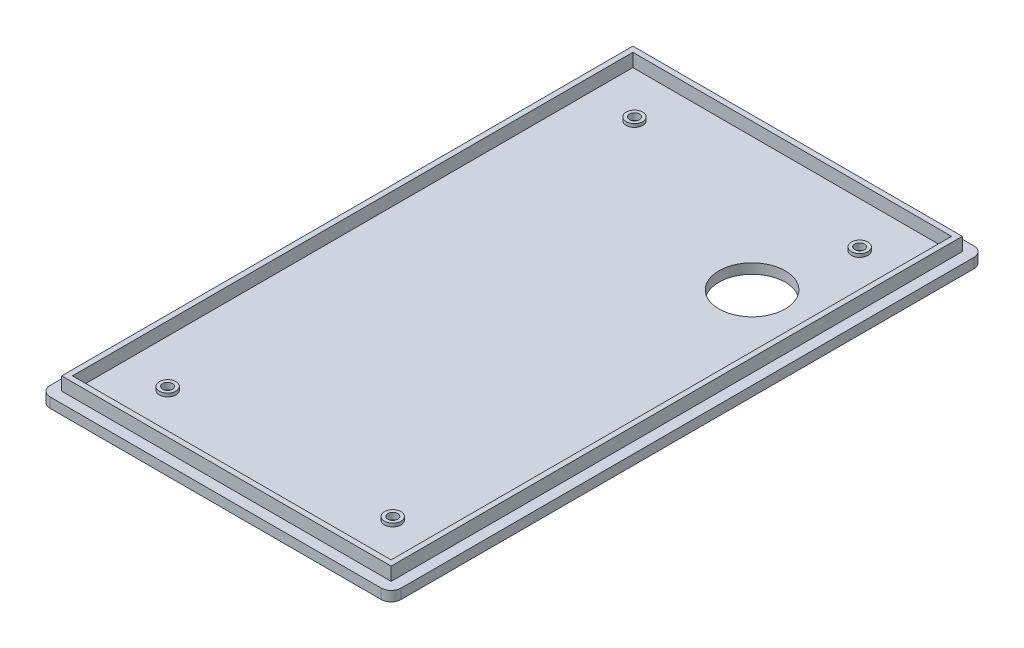
ISO-10303-21;
HEADER;
FILE_DESCRIPTION(('STEP AP214'),'2;1');
FILE_NAME('part.step','',(''),(''),'','','');
FILE_SCHEMA(('AUTOMOTIVE_DESIGN { 1 0 10303 214 1 1 1 1 }'));
ENDSEC;
DATA;
#1=APPLICATION_CONTEXT('core data for automotive mechanical design processes');
#2=APPLICATION_PROTOCOL_DEFINITION('international standard','automotive_design',2000,#1);
#3=PRODUCT_CONTEXT('',#1,'mechanical');
#4=PRODUCT('Part','Part','',(#3));
#5=PRODUCT_RELATED_PRODUCT_CATEGORY('part','',(#4));
#6=PRODUCT_DEFINITION_FORMATION('','',#4);
#7=PRODUCT_DEFINITION_CONTEXT('part definition',#1,'design');
#8=PRODUCT_DEFINITION('design','',#6,#7);
#9=PRODUCT_DEFINITION_SHAPE('','',#8);
#10=(LENGTH_UNIT() NAMED_UNIT(*) SI_UNIT(.MILLI.,.METRE.));
#11=(NAMED_UNIT(*) PLANE_ANGLE_UNIT() SI_UNIT($,.RADIAN.));
#12=(NAMED_UNIT(*) SI_UNIT($,.STERADIAN.) SOLID_ANGLE_UNIT());
#13=UNCERTAINTY_MEASURE_WITH_UNIT(LENGTH_MEASURE(1.E-05),#10,'distance_accuracy_value','');
#14=(GEOMETRIC_REPRESENTATION_CONTEXT(3) GLOBAL_UNCERTAINTY_ASSIGNED_CONTEXT((#13)) GLOBAL_UNIT_ASSIGNED_CONTEXT((#10,
#11,#12)) REPRESENTATION_CONTEXT('',''));
#15=CARTESIAN_POINT('',(0.,0.,0.));
#16=DIRECTION('',(0.,0.,1.));
#17=DIRECTION('',(1.,0.,0.));
#18=AXIS2_PLACEMENT_3D('',#15,#16,#17);
#19=CARTESIAN_POINT('',(-34.,23.,-71.));
#20=DIRECTION('',(0.,-1.,0.));
#21=DIRECTION('',(0.,0.,-1.));
#22=AXIS2_PLACEMENT_3D('',#19,#20,#21);
#23=CYLINDRICAL_SURFACE('',#22,1.5);
#24=CARTESIAN_POINT('',(-34.,2.,-71.));
#25=DIRECTION('',(0.,-1.,0.));
#26=DIRECTION('',(0.,0.,-1.));
#27=AXIS2_PLACEMENT_3D('',#24,#25,#26);
#28=CIRCLE('',#27,1.5);
#29=CARTESIAN_POINT('',(-34.,2.,-72.5));
#30=VERTEX_POINT('',#29);
#31=EDGE_CURVE('E45',#30,#30,#28,.T.);
#32=ORIENTED_EDGE('',*,*,#31,.T.);
#33=EDGE_LOOP('',(#32));
#34=FACE_BOUND('',#33,.T.);
#35=CARTESIAN_POINT('',(-34.,4.,-71.));
#36=DIRECTION('',(0.,1.,0.));
#37=DIRECTION('',(0.,0.,1.));
#38=AXIS2_PLACEMENT_3D('',#35,#36,#37);
#39=CIRCLE('',#38,1.5);
#40=CARTESIAN_POINT('',(-34.,4.,-69.5));
#41=VERTEX_POINT('',#40);
#42=EDGE_CURVE('E863',#41,#41,#39,.F.);
#43=ORIENTED_EDGE('',*,*,#42,.F.);
#44=EDGE_LOOP('',(#43));
#45=FACE_BOUND('',#44,.T.);
#46=ADVANCED_FACE('F41',(#34,#45),#23,.F.);
#47=CARTESIAN_POINT('',(34.,23.,-71.));
#48=DIRECTION('',(0.,-1.,0.));
#49=DIRECTION('',(0.,0.,-1.));
#50=AXIS2_PLACEMENT_3D('',#47,#48,#49);
#51=CYLINDRICAL_SURFACE('',#50,1.5);
#52=CARTESIAN_POINT('',(34.,2.,-71.));
#53=DIRECTION('',(0.,-1.,0.));
#54=DIRECTION('',(0.,0.,-1.));
#55=AXIS2_PLACEMENT_3D('',#52,#53,#54);
#56=CIRCLE('',#55,1.5);
#57=CARTESIAN_POINT('',(34.,2.,-72.5));
#58=VERTEX_POINT('',#57);
#59=EDGE_CURVE('E315',#58,#58,#56,.T.);
#60=ORIENTED_EDGE('',*,*,#59,.T.);
#61=EDGE_LOOP('',(#60));
#62=FACE_BOUND('',#61,.T.);
#63=CARTESIAN_POINT('',(34.,4.,-71.));
#64=DIRECTION('',(0.,1.,0.));
#65=DIRECTION('',(0.,0.,1.));
#66=AXIS2_PLACEMENT_3D('',#63,#64,#65);
#67=CIRCLE('',#66,1.5);
#68=CARTESIAN_POINT('',(34.,4.,-69.5));
#69=VERTEX_POINT('',#68);
#70=EDGE_CURVE('E870',#69,#69,#67,.F.);
#71=ORIENTED_EDGE('',*,*,#70,.F.);
#72=EDGE_LOOP('',(#71));
#73=FACE_BOUND('',#72,.T.);
#74=ADVANCED_FACE('F392',(#62,#73),#51,.F.);
#75=CARTESIAN_POINT('',(34.,23.,70.));
#76=DIRECTION('',(0.,-1.,0.));
#77=DIRECTION('',(0.,0.,-1.));
#78=AXIS2_PLACEMENT_3D('',#75,#76,#77);
#79=CYLINDRICAL_SURFACE('',#78,1.5);
#80=CARTESIAN_POINT('',(34.,2.,70.));
#81=DIRECTION('',(0.,-1.,0.));
#82=DIRECTION('',(0.,0.,-1.));
#83=AXIS2_PLACEMENT_3D('',#80,#81,#82);
#84=CIRCLE('',#83,1.5);
#85=CARTESIAN_POINT('',(34.,2.,68.5));
#86=VERTEX_POINT('',#85);
#87=EDGE_CURVE('E311',#86,#86,#84,.T.);
#88=ORIENTED_EDGE('',*,*,#87,.T.);
#89=EDGE_LOOP('',(#88));
#90=FACE_BOUND('',#89,.T.);
#91=CARTESIAN_POINT('',(34.,4.,70.));
#92=DIRECTION('',(0.,1.,0.));
#93=DIRECTION('',(0.,0.,1.));
#94=AXIS2_PLACEMENT_3D('',#91,#92,#93);
#95=CIRCLE('',#94,1.5);
#96=CARTESIAN_POINT('',(34.,4.,71.5));
#97=VERTEX_POINT('',#96);
#98=EDGE_CURVE('E878',#97,#97,#95,.F.);
#99=ORIENTED_EDGE('',*,*,#98,.F.);
#100=EDGE_LOOP('',(#99));
#101=FACE_BOUND('',#100,.T.);
#102=ADVANCED_FACE('F382',(#90,#101),#79,.F.);
#103=CARTESIAN_POINT('',(-34.,23.,70.));
#104=DIRECTION('',(0.,-1.,0.));
#105=DIRECTION('',(0.,0.,-1.));
#106=AXIS2_PLACEMENT_3D('',#103,#104,#105);
#107=CYLINDRICAL_SURFACE('',#106,1.5);
#108=CARTESIAN_POINT('',(-34.,2.,70.));
#109=DIRECTION('',(0.,-1.,0.));
#110=DIRECTION('',(0.,0.,-1.));
#111=AXIS2_PLACEMENT_3D('',#108,#109,#110);
#112=CIRCLE('',#111,1.5);
#113=CARTESIAN_POINT('',(-34.,2.,68.5));
#114=VERTEX_POINT('',#113);
#115=EDGE_CURVE('E307',#114,#114,#112,.T.);
#116=ORIENTED_EDGE('',*,*,#115,.T.);
#117=EDGE_LOOP('',(#116));
#118=FACE_BOUND('',#117,.T.);
#119=CARTESIAN_POINT('',(-34.,4.,70.));
#120=DIRECTION('',(0.,1.,0.));
#121=DIRECTION('',(0.,0.,1.));
#122=AXIS2_PLACEMENT_3D('',#119,#120,#121);
#123=CIRCLE('',#122,1.5);
#124=CARTESIAN_POINT('',(-34.,4.,71.5));
#125=VERTEX_POINT('',#124);
#126=EDGE_CURVE('E874',#125,#125,#123,.F.);
#127=ORIENTED_EDGE('',*,*,#126,.F.);
#128=EDGE_LOOP('',(#127));
#129=FACE_BOUND('',#128,.T.);
#130=ADVANCED_FACE('F372',(#118,#129),#107,.F.);
#131=CARTESIAN_POINT('',(0.,3.,0.));
#132=DIRECTION('',(0.,1.,0.));
#133=DIRECTION('',(0.,0.,1.));
#134=AXIS2_PLACEMENT_3D('',#131,#132,#133);
#135=PLANE('',#134);
#136=DIRECTION('',(0.,0.,1.));
#137=VECTOR('',#136,1.);
#138=CARTESIAN_POINT('',(53.,3.,0.));
#139=LINE('',#138,#137);
#140=CARTESIAN_POINT('',(53.,3.,-86.5));
#141=VERTEX_POINT('',#140);
#142=CARTESIAN_POINT('',(53.,3.,86.5));
#143=VERTEX_POINT('',#142);
#144=EDGE_CURVE('E228',#141,#143,#139,.T.);
#145=ORIENTED_EDGE('',*,*,#144,.F.);
#146=CARTESIAN_POINT('',(50.,3.,-86.5));
#147=DIRECTION('',(0.,1.,0.));
#148=DIRECTION('',(0.,0.,1.));
#149=AXIS2_PLACEMENT_3D('',#146,#147,#148);
#150=CIRCLE('',#149,3.);
#151=CARTESIAN_POINT('',(50.,3.,-89.5));
#152=VERTEX_POINT('',#151);
#153=EDGE_CURVE('E294',#141,#152,#150,.T.);
#154=ORIENTED_EDGE('',*,*,#153,.T.);
#155=DIRECTION('',(1.,0.,0.));
#156=VECTOR('',#155,1.);
#157=CARTESIAN_POINT('',(0.,3.,-89.5));
#158=LINE('',#157,#156);
#159=CARTESIAN_POINT('',(-50.,3.,-89.5));
#160=VERTEX_POINT('',#159);
#161=EDGE_CURVE('E232',#160,#152,#158,.T.);
#162=ORIENTED_EDGE('',*,*,#161,.F.);
#163=CARTESIAN_POINT('',(-50.,3.,-86.5));
#164=DIRECTION('',(0.,1.,0.));
#165=DIRECTION('',(0.,0.,1.));
#166=AXIS2_PLACEMENT_3D('',#163,#164,#165);
#167=CIRCLE('',#166,3.);
#168=CARTESIAN_POINT('',(-53.,3.,-86.5));
#169=VERTEX_POINT('',#168);
#170=EDGE_CURVE('E291',#160,#169,#167,.T.);
#171=ORIENTED_EDGE('',*,*,#170,.T.);
#172=DIRECTION('',(0.,0.,1.));
#173=VECTOR('',#172,1.);
#174=CARTESIAN_POINT('',(-53.,3.,0.));
#175=LINE('',#174,#173);
#176=CARTESIAN_POINT('',(-53.,3.,86.5));
#177=VERTEX_POINT('',#176);
#178=EDGE_CURVE('E237',#169,#177,#175,.T.);
#179=ORIENTED_EDGE('',*,*,#178,.T.);
#180=CARTESIAN_POINT('',(-50.,3.,86.5));
#181=DIRECTION('',(0.,1.,0.));
#182=DIRECTION('',(0.,0.,1.));
#183=AXIS2_PLACEMENT_3D('',#180,#181,#182);
#184=CIRCLE('',#183,3.);
#185=CARTESIAN_POINT('',(-50.,3.,89.5));
#186=VERTEX_POINT('',#185);
#187=EDGE_CURVE('E64',#177,#186,#184,.T.);
#188=ORIENTED_EDGE('',*,*,#187,.T.);
#189=DIRECTION('',(1.,0.,0.));
#190=VECTOR('',#189,1.);
#191=CARTESIAN_POINT('',(0.,3.,89.5));
#192=LINE('',#191,#190);
#193=CARTESIAN_POINT('',(50.,3.,89.5));
#194=VERTEX_POINT('',#193);
#195=EDGE_CURVE('E240',#186,#194,#192,.T.);
#196=ORIENTED_EDGE('',*,*,#195,.T.);
#197=CARTESIAN_POINT('',(50.,3.,86.5));
#198=DIRECTION('',(0.,1.,0.));
#199=DIRECTION('',(0.,0.,1.));
#200=AXIS2_PLACEMENT_3D('',#197,#198,#199);
#201=CIRCLE('',#200,3.);
#202=EDGE_CURVE('E288',#194,#143,#201,.T.);
#203=ORIENTED_EDGE('',*,*,#202,.T.);
#204=EDGE_LOOP('',(#145,#154,#162,#171,#179,#188,#196,#203));
#205=FACE_BOUND('',#204,.T.);
#206=DIRECTION('',(0.,0.,1.));
#207=VECTOR('',#206,1.);
#208=CARTESIAN_POINT('',(49.75,3.,0.));
#209=LINE('',#208,#207);
#210=CARTESIAN_POINT('',(49.75,3.,-86.25));
#211=VERTEX_POINT('',#210);
#212=CARTESIAN_POINT('',(49.75,3.,86.25));
#213=VERTEX_POINT('',#212);
#214=EDGE_CURVE('E210',#211,#213,#209,.T.);
#215=ORIENTED_EDGE('',*,*,#214,.T.);
#216=DIRECTION('',(-1.,0.,0.));
#217=VECTOR('',#216,1.);
#218=CARTESIAN_POINT('',(0.,3.,86.25));
#219=LINE('',#218,#217);
#220=CARTESIAN_POINT('',(-49.75,3.,86.25));
#221=VERTEX_POINT('',#220);
#222=EDGE_CURVE('E184',#213,#221,#219,.T.);
#223=ORIENTED_EDGE('',*,*,#222,.T.);
#224=DIRECTION('',(0.,0.,-1.));
#225=VECTOR('',#224,1.);
#226=CARTESIAN_POINT('',(-49.75,3.,0.));
#227=LINE('',#226,#225);
#228=CARTESIAN_POINT('',(-49.75,3.,-86.25));
#229=VERTEX_POINT('',#228);
#230=EDGE_CURVE('E201',#221,#229,#227,.T.);
#231=ORIENTED_EDGE('',*,*,#230,.T.);
#232=DIRECTION('',(1.,0.,0.));
#233=VECTOR('',#232,1.);
#234=CARTESIAN_POINT('',(0.,3.,-86.25));
#235=LINE('',#234,#233);
#236=EDGE_CURVE('E206',#229,#211,#235,.T.);
#237=ORIENTED_EDGE('',*,*,#236,.T.);
#238=EDGE_LOOP('',(#215,#223,#231,#237));
#239=FACE_BOUND('',#238,.T.);
#240=ADVANCED_FACE('F369',(#205,#239),#135,.T.);
#241=CARTESIAN_POINT('',(53.,3.,0.));
#242=DIRECTION('',(1.,0.,0.));
#243=DIRECTION('',(0.,0.,-1.));
#244=AXIS2_PLACEMENT_3D('',#241,#242,#243);
#245=PLANE('',#244);
#246=DIRECTION('',(0.,0.,1.));
#247=VECTOR('',#246,1.);
#248=CARTESIAN_POINT('',(53.,0.,0.));
#249=LINE('',#248,#247);
#250=CARTESIAN_POINT('',(53.,0.,-86.5));
#251=VERTEX_POINT('',#250);
#252=CARTESIAN_POINT('',(53.,0.,86.5));
#253=VERTEX_POINT('',#252);
#254=EDGE_CURVE('E227',#251,#253,#249,.T.);
#255=ORIENTED_EDGE('',*,*,#254,.F.);
#256=DIRECTION('',(0.,-1.,0.));
#257=VECTOR('',#256,1.);
#258=CARTESIAN_POINT('',(53.,3.,-86.5));
#259=LINE('',#258,#257);
#260=EDGE_CURVE('E283',#251,#141,#259,.F.);
#261=ORIENTED_EDGE('',*,*,#260,.T.);
#262=ORIENTED_EDGE('',*,*,#144,.T.);
#263=DIRECTION('',(0.,-1.,0.));
#264=VECTOR('',#263,1.);
#265=CARTESIAN_POINT('',(53.,0.,86.5));
#266=LINE('',#265,#264);
#267=EDGE_CURVE('E279',#143,#253,#266,.T.);
#268=ORIENTED_EDGE('',*,*,#267,.T.);
#269=EDGE_LOOP('',(#255,#261,#262,#268));
#270=FACE_BOUND('',#269,.T.);
#271=ADVANCED_FACE('F371',(#270),#245,.T.);
#272=CARTESIAN_POINT('',(0.,3.,-89.5));
#273=DIRECTION('',(0.,0.,-1.));
#274=DIRECTION('',(-1.,0.,0.));
#275=AXIS2_PLACEMENT_3D('',#272,#273,#274);
#276=PLANE('',#275);
#277=ORIENTED_EDGE('',*,*,#161,.T.);
#278=DIRECTION('',(0.,-1.,0.));
#279=VECTOR('',#278,1.);
#280=CARTESIAN_POINT('',(50.,3.,-89.5));
#281=LINE('',#280,#279);
#282=CARTESIAN_POINT('',(50.,0.,-89.5));
#283=VERTEX_POINT('',#282);
#284=EDGE_CURVE('E263',#152,#283,#281,.T.);
#285=ORIENTED_EDGE('',*,*,#284,.T.);
#286=DIRECTION('',(1.,0.,0.));
#287=VECTOR('',#286,1.);
#288=CARTESIAN_POINT('',(0.,0.,-89.5));
#289=LINE('',#288,#287);
#290=CARTESIAN_POINT('',(-50.,0.,-89.5));
#291=VERTEX_POINT('',#290);
#292=EDGE_CURVE('E247',#291,#283,#289,.T.);
#293=ORIENTED_EDGE('',*,*,#292,.F.);
#294=DIRECTION('',(0.,-1.,0.));
#295=VECTOR('',#294,1.);
#296=CARTESIAN_POINT('',(-50.,3.,-89.5));
#297=LINE('',#296,#295);
#298=EDGE_CURVE('E243',#291,#160,#297,.F.);
#299=ORIENTED_EDGE('',*,*,#298,.T.);
#300=EDGE_LOOP('',(#277,#285,#293,#299));
#301=FACE_BOUND('',#300,.T.);
#302=ADVANCED_FACE('F379',(#301),#276,.T.);
#303=CARTESIAN_POINT('',(-53.,3.,0.));
#304=DIRECTION('',(1.,0.,0.));
#305=DIRECTION('',(0.,0.,-1.));
#306=AXIS2_PLACEMENT_3D('',#303,#304,#305);
#307=PLANE('',#306);
#308=ORIENTED_EDGE('',*,*,#178,.F.);
#309=DIRECTION('',(0.,-1.,0.));
#310=VECTOR('',#309,1.);
#311=CARTESIAN_POINT('',(-53.,0.,-86.5));
#312=LINE('',#311,#310);
#313=CARTESIAN_POINT('',(-53.,0.,-86.5));
#314=VERTEX_POINT('',#313);
#315=EDGE_CURVE('E300',#169,#314,#312,.T.);
#316=ORIENTED_EDGE('',*,*,#315,.T.);
#317=DIRECTION('',(0.,0.,1.));
#318=VECTOR('',#317,1.);
#319=CARTESIAN_POINT('',(-53.,0.,0.));
#320=LINE('',#319,#318);
#321=CARTESIAN_POINT('',(-53.,0.,86.5));
#322=VERTEX_POINT('',#321);
#323=EDGE_CURVE('E251',#314,#322,#320,.T.);
#324=ORIENTED_EDGE('',*,*,#323,.T.);
#325=DIRECTION('',(0.,-1.,0.));
#326=VECTOR('',#325,1.);
#327=CARTESIAN_POINT('',(-53.,3.,86.5));
#328=LINE('',#327,#326);
#329=EDGE_CURVE('E297',#322,#177,#328,.F.);
#330=ORIENTED_EDGE('',*,*,#329,.T.);
#331=EDGE_LOOP('',(#308,#316,#324,#330));
#332=FACE_BOUND('',#331,.T.);
#333=ADVANCED_FACE('F745',(#332),#307,.F.);
#334=CARTESIAN_POINT('',(0.,3.,89.5));
#335=DIRECTION('',(0.,0.,-1.));
#336=DIRECTION('',(-1.,0.,0.));
#337=AXIS2_PLACEMENT_3D('',#334,#335,#336);
#338=PLANE('',#337);
#339=DIRECTION('',(1.,0.,0.));
#340=VECTOR('',#339,1.);
#341=CARTESIAN_POINT('',(0.,0.,89.5));
#342=LINE('',#341,#340);
#343=CARTESIAN_POINT('',(-50.,0.,89.5));
#344=VERTEX_POINT('',#343);
#345=CARTESIAN_POINT('',(50.,0.,89.5));
#346=VERTEX_POINT('',#345);
#347=EDGE_CURVE('E233',#344,#346,#342,.T.);
#348=ORIENTED_EDGE('',*,*,#347,.T.);
#349=DIRECTION('',(0.,-1.,0.));
#350=VECTOR('',#349,1.);
#351=CARTESIAN_POINT('',(50.,3.,89.5));
#352=LINE('',#351,#350);
#353=EDGE_CURVE('E11',#346,#194,#352,.F.);
#354=ORIENTED_EDGE('',*,*,#353,.T.);
#355=ORIENTED_EDGE('',*,*,#195,.F.);
#356=DIRECTION('',(0.,-1.,0.));
#357=VECTOR('',#356,1.);
#358=CARTESIAN_POINT('',(-50.,3.,89.5));
#359=LINE('',#358,#357);
#360=EDGE_CURVE('E51',#186,#344,#359,.T.);
#361=ORIENTED_EDGE('',*,*,#360,.T.);
#362=EDGE_LOOP('',(#348,#354,#355,#361));
#363=FACE_BOUND('',#362,.T.);
#364=ADVANCED_FACE('F738',(#363),#338,.F.);
#365=CARTESIAN_POINT('',(0.,0.,0.));
#366=DIRECTION('',(0.,1.,0.));
#367=DIRECTION('',(0.,0.,1.));
#368=AXIS2_PLACEMENT_3D('',#365,#366,#367);
#369=PLANE('',#368);
#370=CARTESIAN_POINT('',(-34.,0.,-71.));
#371=DIRECTION('',(0.,-1.,0.));
#372=DIRECTION('',(0.,0.,-1.));
#373=AXIS2_PLACEMENT_3D('',#370,#371,#372);
#374=CIRCLE('',#373,3.);
#375=CARTESIAN_POINT('',(-34.,0.,-74.));
#376=VERTEX_POINT('',#375);
#377=EDGE_CURVE('E794',#376,#376,#374,.T.);
#378=ORIENTED_EDGE('',*,*,#377,.F.);
#379=EDGE_LOOP('',(#378));
#380=FACE_BOUND('',#379,.T.);
#381=CARTESIAN_POINT('',(34.,0.,-71.));
#382=DIRECTION('',(0.,-1.,0.));
#383=DIRECTION('',(0.,0.,-1.));
#384=AXIS2_PLACEMENT_3D('',#381,#382,#383);
#385=CIRCLE('',#384,3.);
#386=CARTESIAN_POINT('',(34.,0.,-74.));
#387=VERTEX_POINT('',#386);
#388=EDGE_CURVE('E798',#387,#387,#385,.T.);
#389=ORIENTED_EDGE('',*,*,#388,.F.);
#390=EDGE_LOOP('',(#389));
#391=FACE_BOUND('',#390,.T.);
#392=CARTESIAN_POINT('',(34.,0.,70.));
#393=DIRECTION('',(0.,-1.,0.));
#394=DIRECTION('',(0.,0.,-1.));
#395=AXIS2_PLACEMENT_3D('',#392,#393,#394);
#396=CIRCLE('',#395,3.);
#397=CARTESIAN_POINT('',(34.,0.,67.));
#398=VERTEX_POINT('',#397);
#399=EDGE_CURVE('E802',#398,#398,#396,.T.);
#400=ORIENTED_EDGE('',*,*,#399,.F.);
#401=EDGE_LOOP('',(#400));
#402=FACE_BOUND('',#401,.T.);
#403=CARTESIAN_POINT('',(-34.,0.,70.));
#404=DIRECTION('',(0.,-1.,0.));
#405=DIRECTION('',(0.,0.,-1.));
#406=AXIS2_PLACEMENT_3D('',#403,#404,#405);
#407=CIRCLE('',#406,3.);
#408=CARTESIAN_POINT('',(-34.,0.,67.));
#409=VERTEX_POINT('',#408);
#410=EDGE_CURVE('E330',#409,#409,#407,.T.);
#411=ORIENTED_EDGE('',*,*,#410,.F.);
#412=EDGE_LOOP('',(#411));
#413=FACE_BOUND('',#412,.T.);
#414=CARTESIAN_POINT('',(28.,0.,-44.5));
#415=DIRECTION('',(0.,-1.,0.));
#416=DIRECTION('',(0.,0.,-1.));
#417=AXIS2_PLACEMENT_3D('',#414,#415,#416);
#418=CIRCLE('',#417,10.);
#419=CARTESIAN_POINT('',(28.,0.,-54.5));
#420=VERTEX_POINT('',#419);
#421=EDGE_CURVE('E260',#420,#420,#418,.T.);
#422=ORIENTED_EDGE('',*,*,#421,.F.);
#423=EDGE_LOOP('',(#422));
#424=FACE_BOUND('',#423,.T.);
#425=ORIENTED_EDGE('',*,*,#292,.T.);
#426=CARTESIAN_POINT('',(50.,0.,-86.5));
#427=DIRECTION('',(0.,1.,0.));
#428=DIRECTION('',(0.,0.,1.));
#429=AXIS2_PLACEMENT_3D('',#426,#427,#428);
#430=CIRCLE('',#429,3.);
#431=EDGE_CURVE('E276',#283,#251,#430,.F.);
#432=ORIENTED_EDGE('',*,*,#431,.T.);
#433=ORIENTED_EDGE('',*,*,#254,.T.);
#434=CARTESIAN_POINT('',(50.,0.,86.5));
#435=DIRECTION('',(0.,1.,0.));
#436=DIRECTION('',(0.,0.,1.));
#437=AXIS2_PLACEMENT_3D('',#434,#435,#436);
#438=CIRCLE('',#437,3.);
#439=EDGE_CURVE('E270',#253,#346,#438,.F.);
#440=ORIENTED_EDGE('',*,*,#439,.T.);
#441=ORIENTED_EDGE('',*,*,#347,.F.);
#442=CARTESIAN_POINT('',(-50.,0.,86.5));
#443=DIRECTION('',(0.,1.,0.));
#444=DIRECTION('',(0.,0.,1.));
#445=AXIS2_PLACEMENT_3D('',#442,#443,#444);
#446=CIRCLE('',#445,3.);
#447=EDGE_CURVE('E267',#344,#322,#446,.F.);
#448=ORIENTED_EDGE('',*,*,#447,.T.);
#449=ORIENTED_EDGE('',*,*,#323,.F.);
#450=CARTESIAN_POINT('',(-50.,0.,-86.5));
#451=DIRECTION('',(0.,1.,0.));
#452=DIRECTION('',(0.,0.,1.));
#453=AXIS2_PLACEMENT_3D('',#450,#451,#452);
#454=CIRCLE('',#453,3.);
#455=EDGE_CURVE('E273',#314,#291,#454,.F.);
#456=ORIENTED_EDGE('',*,*,#455,.T.);
#457=EDGE_LOOP('',(#425,#432,#433,#440,#441,#448,#449,#456));
#458=FACE_BOUND('',#457,.T.);
#459=ADVANCED_FACE('F422',(#380,#391,#402,#413,#424,#458),#369,.F.);
#460=CARTESIAN_POINT('',(0.,7.,84.625));
#461=DIRECTION('',(0.,0.,1.));
#462=DIRECTION('',(1.,0.,0.));
#463=AXIS2_PLACEMENT_3D('',#460,#461,#462);
#464=PLANE('',#463);
#465=DIRECTION('',(1.,0.,0.));
#466=VECTOR('',#465,1.);
#467=CARTESIAN_POINT('',(0.,3.,84.625));
#468=LINE('',#467,#466);
#469=CARTESIAN_POINT('',(-48.125,3.,84.625));
#470=VERTEX_POINT('',#469);
#471=CARTESIAN_POINT('',(48.125,3.,84.625));
#472=VERTEX_POINT('',#471);
#473=EDGE_CURVE('E223',#470,#472,#468,.T.);
#474=ORIENTED_EDGE('',*,*,#473,.F.);
#475=DIRECTION('',(0.,-1.,0.));
#476=VECTOR('',#475,1.);
#477=CARTESIAN_POINT('',(-48.125,7.,84.625));
#478=LINE('',#477,#476);
#479=CARTESIAN_POINT('',(-48.125,7.,84.625));
#480=VERTEX_POINT('',#479);
#481=EDGE_CURVE('E202',#480,#470,#478,.T.);
#482=ORIENTED_EDGE('',*,*,#481,.F.);
#483=DIRECTION('',(-1.,0.,0.));
#484=VECTOR('',#483,1.);
#485=CARTESIAN_POINT('',(0.,7.,84.625));
#486=LINE('',#485,#484);
#487=CARTESIAN_POINT('',(48.125,7.,84.625));
#488=VERTEX_POINT('',#487);
#489=EDGE_CURVE('E337',#488,#480,#486,.T.);
#490=ORIENTED_EDGE('',*,*,#489,.F.);
#491=DIRECTION('',(0.,-1.,0.));
#492=VECTOR('',#491,1.);
#493=CARTESIAN_POINT('',(48.125,7.,84.625));
#494=LINE('',#493,#492);
#495=EDGE_CURVE('E186',#488,#472,#494,.T.);
#496=ORIENTED_EDGE('',*,*,#495,.T.);
#497=EDGE_LOOP('',(#474,#482,#490,#496));
#498=FACE_BOUND('',#497,.T.);
#499=ADVANCED_FACE('F418',(#498),#464,.F.);
#500=CARTESIAN_POINT('',(-48.125,7.,0.));
#501=DIRECTION('',(-1.,0.,0.));
#502=DIRECTION('',(0.,0.,1.));
#503=AXIS2_PLACEMENT_3D('',#500,#501,#502);
#504=PLANE('',#503);
#505=DIRECTION('',(0.,0.,1.));
#506=VECTOR('',#505,1.);
#507=CARTESIAN_POINT('',(-48.125,3.,0.));
#508=LINE('',#507,#506);
#509=CARTESIAN_POINT('',(-48.125,3.,-84.625));
#510=VERTEX_POINT('',#509);
#511=EDGE_CURVE('E219',#510,#470,#508,.T.);
#512=ORIENTED_EDGE('',*,*,#511,.F.);
#513=DIRECTION('',(0.,-1.,0.));
#514=VECTOR('',#513,1.);
#515=CARTESIAN_POINT('',(-48.125,7.,-84.625));
#516=LINE('',#515,#514);
#517=CARTESIAN_POINT('',(-48.125,7.,-84.625));
#518=VERTEX_POINT('',#517);
#519=EDGE_CURVE('E353',#518,#510,#516,.T.);
#520=ORIENTED_EDGE('',*,*,#519,.F.);
#521=DIRECTION('',(0.,0.,-1.));
#522=VECTOR('',#521,1.);
#523=CARTESIAN_POINT('',(-48.125,7.,0.));
#524=LINE('',#523,#522);
#525=EDGE_CURVE('E341',#480,#518,#524,.T.);
#526=ORIENTED_EDGE('',*,*,#525,.F.);
#527=ORIENTED_EDGE('',*,*,#481,.T.);
#528=EDGE_LOOP('',(#512,#520,#526,#527));
#529=FACE_BOUND('',#528,.T.);
#530=ADVANCED_FACE('F414',(#529),#504,.F.);
#531=CARTESIAN_POINT('',(0.,7.,-84.625));
#532=DIRECTION('',(0.,0.,-1.));
#533=DIRECTION('',(-1.,0.,0.));
#534=AXIS2_PLACEMENT_3D('',#531,#532,#533);
#535=PLANE('',#534);
#536=DIRECTION('',(-1.,0.,0.));
#537=VECTOR('',#536,1.);
#538=CARTESIAN_POINT('',(0.,3.,-84.625));
#539=LINE('',#538,#537);
#540=CARTESIAN_POINT('',(48.125,3.,-84.625));
#541=VERTEX_POINT('',#540);
#542=EDGE_CURVE('E215',#541,#510,#539,.T.);
#543=ORIENTED_EDGE('',*,*,#542,.F.);
#544=DIRECTION('',(0.,-1.,0.));
#545=VECTOR('',#544,1.);
#546=CARTESIAN_POINT('',(48.125,7.,-84.625));
#547=LINE('',#546,#545);
#548=CARTESIAN_POINT('',(48.125,7.,-84.625));
#549=VERTEX_POINT('',#548);
#550=EDGE_CURVE('E191',#549,#541,#547,.T.);
#551=ORIENTED_EDGE('',*,*,#550,.F.);
#552=DIRECTION('',(1.,0.,0.));
#553=VECTOR('',#552,1.);
#554=CARTESIAN_POINT('',(0.,7.,-84.625));
#555=LINE('',#554,#553);
#556=EDGE_CURVE('E344',#518,#549,#555,.T.);
#557=ORIENTED_EDGE('',*,*,#556,.F.);
#558=ORIENTED_EDGE('',*,*,#519,.T.);
#559=EDGE_LOOP('',(#543,#551,#557,#558));
#560=FACE_BOUND('',#559,.T.);
#561=ADVANCED_FACE('F411',(#560),#535,.F.);
#562=CARTESIAN_POINT('',(0.,7.,86.25));
#563=DIRECTION('',(0.,0.,-1.));
#564=DIRECTION('',(-1.,0.,0.));
#565=AXIS2_PLACEMENT_3D('',#562,#563,#564);
#566=PLANE('',#565);
#567=ORIENTED_EDGE('',*,*,#222,.F.);
#568=DIRECTION('',(0.,-1.,0.));
#569=VECTOR('',#568,1.);
#570=CARTESIAN_POINT('',(49.75,7.,86.25));
#571=LINE('',#570,#569);
#572=CARTESIAN_POINT('',(49.75,7.,86.25));
#573=VERTEX_POINT('',#572);
#574=EDGE_CURVE('E161',#573,#213,#571,.T.);
#575=ORIENTED_EDGE('',*,*,#574,.F.);
#576=DIRECTION('',(1.,0.,0.));
#577=VECTOR('',#576,1.);
#578=CARTESIAN_POINT('',(0.,7.,86.25));
#579=LINE('',#578,#577);
#580=CARTESIAN_POINT('',(-49.75,7.,86.25));
#581=VERTEX_POINT('',#580);
#582=EDGE_CURVE('E169',#581,#573,#579,.T.);
#583=ORIENTED_EDGE('',*,*,#582,.F.);
#584=DIRECTION('',(0.,-1.,0.));
#585=VECTOR('',#584,1.);
#586=CARTESIAN_POINT('',(-49.75,7.,86.25));
#587=LINE('',#586,#585);
#588=EDGE_CURVE('E349',#581,#221,#587,.T.);
#589=ORIENTED_EDGE('',*,*,#588,.T.);
#590=EDGE_LOOP('',(#567,#575,#583,#589));
#591=FACE_BOUND('',#590,.T.);
#592=ADVANCED_FACE('F182',(#591),#566,.F.);
#593=CARTESIAN_POINT('',(49.75,7.,0.));
#594=DIRECTION('',(-1.,0.,0.));
#595=DIRECTION('',(0.,0.,1.));
#596=AXIS2_PLACEMENT_3D('',#593,#594,#595);
#597=PLANE('',#596);
#598=ORIENTED_EDGE('',*,*,#214,.F.);
#599=DIRECTION('',(0.,-1.,0.));
#600=VECTOR('',#599,1.);
#601=CARTESIAN_POINT('',(49.75,7.,-86.25));
#602=LINE('',#601,#600);
#603=CARTESIAN_POINT('',(49.75,7.,-86.25));
#604=VERTEX_POINT('',#603);
#605=EDGE_CURVE('E164',#604,#211,#602,.T.);
#606=ORIENTED_EDGE('',*,*,#605,.F.);
#607=DIRECTION('',(0.,0.,-1.));
#608=VECTOR('',#607,1.);
#609=CARTESIAN_POINT('',(49.75,7.,0.));
#610=LINE('',#609,#608);
#611=EDGE_CURVE('E157',#573,#604,#610,.T.);
#612=ORIENTED_EDGE('',*,*,#611,.F.);
#613=ORIENTED_EDGE('',*,*,#574,.T.);
#614=EDGE_LOOP('',(#598,#606,#612,#613));
#615=FACE_BOUND('',#614,.T.);
#616=ADVANCED_FACE('F159',(#615),#597,.F.);
#617=CARTESIAN_POINT('',(0.,7.,-86.25));
#618=DIRECTION('',(0.,0.,1.));
#619=DIRECTION('',(1.,0.,0.));
#620=AXIS2_PLACEMENT_3D('',#617,#618,#619);
#621=PLANE('',#620);
#622=ORIENTED_EDGE('',*,*,#236,.F.);
#623=DIRECTION('',(0.,-1.,0.));
#624=VECTOR('',#623,1.);
#625=CARTESIAN_POINT('',(-49.75,7.,-86.25));
#626=LINE('',#625,#624);
#627=CARTESIAN_POINT('',(-49.75,7.,-86.25));
#628=VERTEX_POINT('',#627);
#629=EDGE_CURVE('E193',#628,#229,#626,.T.);
#630=ORIENTED_EDGE('',*,*,#629,.F.);
#631=DIRECTION('',(-1.,0.,0.));
#632=VECTOR('',#631,1.);
#633=CARTESIAN_POINT('',(0.,7.,-86.25));
#634=LINE('',#633,#632);
#635=EDGE_CURVE('E168',#604,#628,#634,.T.);
#636=ORIENTED_EDGE('',*,*,#635,.F.);
#637=ORIENTED_EDGE('',*,*,#605,.T.);
#638=EDGE_LOOP('',(#622,#630,#636,#637));
#639=FACE_BOUND('',#638,.T.);
#640=ADVANCED_FACE('F367',(#639),#621,.F.);
#641=CARTESIAN_POINT('',(-49.75,7.,0.));
#642=DIRECTION('',(1.,0.,0.));
#643=DIRECTION('',(0.,0.,-1.));
#644=AXIS2_PLACEMENT_3D('',#641,#642,#643);
#645=PLANE('',#644);
#646=ORIENTED_EDGE('',*,*,#230,.F.);
#647=ORIENTED_EDGE('',*,*,#588,.F.);
#648=DIRECTION('',(0.,0.,1.));
#649=VECTOR('',#648,1.);
#650=CARTESIAN_POINT('',(-49.75,7.,0.));
#651=LINE('',#650,#649);
#652=EDGE_CURVE('E175',#628,#581,#651,.T.);
#653=ORIENTED_EDGE('',*,*,#652,.F.);
#654=ORIENTED_EDGE('',*,*,#629,.T.);
#655=EDGE_LOOP('',(#646,#647,#653,#654));
#656=FACE_BOUND('',#655,.T.);
#657=ADVANCED_FACE('F365',(#656),#645,.F.);
#658=CARTESIAN_POINT('',(48.125,7.,0.));
#659=DIRECTION('',(1.,0.,0.));
#660=DIRECTION('',(0.,0.,-1.));
#661=AXIS2_PLACEMENT_3D('',#658,#659,#660);
#662=PLANE('',#661);
#663=DIRECTION('',(0.,0.,-1.));
#664=VECTOR('',#663,1.);
#665=CARTESIAN_POINT('',(48.125,3.,0.));
#666=LINE('',#665,#664);
#667=EDGE_CURVE('E197',#472,#541,#666,.T.);
#668=ORIENTED_EDGE('',*,*,#667,.F.);
#669=ORIENTED_EDGE('',*,*,#495,.F.);
#670=DIRECTION('',(0.,0.,1.));
#671=VECTOR('',#670,1.);
#672=CARTESIAN_POINT('',(48.125,7.,0.));
#673=LINE('',#672,#671);
#674=EDGE_CURVE('E347',#549,#488,#673,.T.);
#675=ORIENTED_EDGE('',*,*,#674,.F.);
#676=ORIENTED_EDGE('',*,*,#550,.T.);
#677=EDGE_LOOP('',(#668,#669,#675,#676));
#678=FACE_BOUND('',#677,.T.);
#679=ADVANCED_FACE('F407',(#678),#662,.F.);
#680=CARTESIAN_POINT('',(0.,7.,0.));
#681=DIRECTION('',(0.,1.,0.));
#682=DIRECTION('',(0.,0.,1.));
#683=AXIS2_PLACEMENT_3D('',#680,#681,#682);
#684=PLANE('',#683);
#685=ORIENTED_EDGE('',*,*,#582,.T.);
#686=ORIENTED_EDGE('',*,*,#611,.T.);
#687=ORIENTED_EDGE('',*,*,#635,.T.);
#688=ORIENTED_EDGE('',*,*,#652,.T.);
#689=EDGE_LOOP('',(#685,#686,#687,#688));
#690=FACE_BOUND('',#689,.T.);
#691=ORIENTED_EDGE('',*,*,#489,.T.);
#692=ORIENTED_EDGE('',*,*,#525,.T.);
#693=ORIENTED_EDGE('',*,*,#556,.T.);
#694=ORIENTED_EDGE('',*,*,#674,.T.);
#695=EDGE_LOOP('',(#691,#692,#693,#694));
#696=FACE_BOUND('',#695,.T.);
#697=ADVANCED_FACE('F172',(#690,#696),#684,.T.);
#698=CARTESIAN_POINT('',(34.,3.,70.));
#699=DIRECTION('',(0.,1.,0.));
#700=DIRECTION('',(0.,0.,1.));
#701=AXIS2_PLACEMENT_3D('',#698,#699,#700);
#702=CIRCLE('',#701,2.5);
#703=CARTESIAN_POINT('',(34.,3.,72.5));
#704=VERTEX_POINT('',#703);
#705=EDGE_CURVE('E859',#704,#704,#702,.T.);
#706=ORIENTED_EDGE('',*,*,#705,.F.);
#707=EDGE_LOOP('',(#706));
#708=FACE_BOUND('',#707,.T.);
#709=CARTESIAN_POINT('',(-34.,3.,70.));
#710=DIRECTION('',(0.,1.,0.));
#711=DIRECTION('',(0.,0.,1.));
#712=AXIS2_PLACEMENT_3D('',#709,#710,#711);
#713=CIRCLE('',#712,2.5);
#714=CARTESIAN_POINT('',(-34.,3.,72.5));
#715=VERTEX_POINT('',#714);
#716=EDGE_CURVE('E851',#715,#715,#713,.T.);
#717=ORIENTED_EDGE('',*,*,#716,.F.);
#718=EDGE_LOOP('',(#717));
#719=FACE_BOUND('',#718,.T.);
#720=CARTESIAN_POINT('',(34.,3.,-71.));
#721=DIRECTION('',(0.,1.,0.));
#722=DIRECTION('',(0.,0.,1.));
#723=AXIS2_PLACEMENT_3D('',#720,#721,#722);
#724=CIRCLE('',#723,2.5);
#725=CARTESIAN_POINT('',(34.,3.,-68.5));
#726=VERTEX_POINT('',#725);
#727=EDGE_CURVE('E843',#726,#726,#724,.T.);
#728=ORIENTED_EDGE('',*,*,#727,.F.);
#729=EDGE_LOOP('',(#728));
#730=FACE_BOUND('',#729,.T.);
#731=CARTESIAN_POINT('',(-34.,3.,-71.));
#732=DIRECTION('',(0.,1.,0.));
#733=DIRECTION('',(0.,0.,1.));
#734=AXIS2_PLACEMENT_3D('',#731,#732,#733);
#735=CIRCLE('',#734,2.5);
#736=CARTESIAN_POINT('',(-34.,3.,-68.5));
#737=VERTEX_POINT('',#736);
#738=EDGE_CURVE('E820',#737,#737,#735,.T.);
#739=ORIENTED_EDGE('',*,*,#738,.F.);
#740=EDGE_LOOP('',(#739));
#741=FACE_BOUND('',#740,.T.);
#742=CARTESIAN_POINT('',(28.,3.,-44.5));
#743=DIRECTION('',(0.,1.,0.));
#744=DIRECTION('',(0.,0.,1.));
#745=AXIS2_PLACEMENT_3D('',#742,#743,#744);
#746=CIRCLE('',#745,10.);
#747=CARTESIAN_POINT('',(28.,3.,-34.5));
#748=VERTEX_POINT('',#747);
#749=EDGE_CURVE('E180',#748,#748,#746,.T.);
#750=ORIENTED_EDGE('',*,*,#749,.F.);
#751=EDGE_LOOP('',(#750));
#752=FACE_BOUND('',#751,.T.);
#753=ORIENTED_EDGE('',*,*,#511,.T.);
#754=ORIENTED_EDGE('',*,*,#473,.T.);
#755=ORIENTED_EDGE('',*,*,#667,.T.);
#756=ORIENTED_EDGE('',*,*,#542,.T.);
#757=EDGE_LOOP('',(#753,#754,#755,#756));
#758=FACE_BOUND('',#757,.T.);
#759=ADVANCED_FACE('F374',(#708,#719,#730,#741,#752,#758),#135,.T.);
#760=CARTESIAN_POINT('',(28.,7.,-44.5));
#761=DIRECTION('',(0.,-1.,0.));
#762=DIRECTION('',(0.,0.,-1.));
#763=AXIS2_PLACEMENT_3D('',#760,#761,#762);
#764=CYLINDRICAL_SURFACE('',#763,10.);
#765=ORIENTED_EDGE('',*,*,#749,.T.);
#766=EDGE_LOOP('',(#765));
#767=FACE_BOUND('',#766,.T.);
#768=ORIENTED_EDGE('',*,*,#421,.T.);
#769=EDGE_LOOP('',(#768));
#770=FACE_BOUND('',#769,.T.);
#771=ADVANCED_FACE('F389',(#767,#770),#764,.F.);
#772=CARTESIAN_POINT('',(50.,3.,-86.5));
#773=DIRECTION('',(0.,-1.,0.));
#774=DIRECTION('',(0.,0.,-1.));
#775=AXIS2_PLACEMENT_3D('',#772,#773,#774);
#776=CYLINDRICAL_SURFACE('',#775,3.);
#777=ORIENTED_EDGE('',*,*,#153,.F.);
#778=ORIENTED_EDGE('',*,*,#260,.F.);
#779=ORIENTED_EDGE('',*,*,#431,.F.);
#780=ORIENTED_EDGE('',*,*,#284,.F.);
#781=EDGE_LOOP('',(#777,#778,#779,#780));
#782=FACE_BOUND('',#781,.T.);
#783=ADVANCED_FACE('F403',(#782),#776,.T.);
#784=CARTESIAN_POINT('',(-50.,3.,-86.5));
#785=DIRECTION('',(0.,1.,0.));
#786=DIRECTION('',(0.,0.,1.));
#787=AXIS2_PLACEMENT_3D('',#784,#785,#786);
#788=CYLINDRICAL_SURFACE('',#787,3.);
#789=ORIENTED_EDGE('',*,*,#170,.F.);
#790=ORIENTED_EDGE('',*,*,#298,.F.);
#791=ORIENTED_EDGE('',*,*,#455,.F.);
#792=ORIENTED_EDGE('',*,*,#315,.F.);
#793=EDGE_LOOP('',(#789,#790,#791,#792));
#794=FACE_BOUND('',#793,.T.);
#795=ADVANCED_FACE('F470',(#794),#788,.T.);
#796=CARTESIAN_POINT('',(50.,3.,86.5));
#797=DIRECTION('',(0.,1.,0.));
#798=DIRECTION('',(0.,0.,1.));
#799=AXIS2_PLACEMENT_3D('',#796,#797,#798);
#800=CYLINDRICAL_SURFACE('',#799,3.);
#801=ORIENTED_EDGE('',*,*,#202,.F.);
#802=ORIENTED_EDGE('',*,*,#353,.F.);
#803=ORIENTED_EDGE('',*,*,#439,.F.);
#804=ORIENTED_EDGE('',*,*,#267,.F.);
#805=EDGE_LOOP('',(#801,#802,#803,#804));
#806=FACE_BOUND('',#805,.T.);
#807=ADVANCED_FACE('F479',(#806),#800,.T.);
#808=CARTESIAN_POINT('',(-50.,3.,86.5));
#809=DIRECTION('',(0.,-1.,0.));
#810=DIRECTION('',(0.,0.,-1.));
#811=AXIS2_PLACEMENT_3D('',#808,#809,#810);
#812=CYLINDRICAL_SURFACE('',#811,3.);
#813=ORIENTED_EDGE('',*,*,#187,.F.);
#814=ORIENTED_EDGE('',*,*,#329,.F.);
#815=ORIENTED_EDGE('',*,*,#447,.F.);
#816=ORIENTED_EDGE('',*,*,#360,.F.);
#817=EDGE_LOOP('',(#813,#814,#815,#816));
#818=FACE_BOUND('',#817,.T.);
#819=ADVANCED_FACE('F43',(#818),#812,.T.);
#820=CARTESIAN_POINT('',(-34.,2.,70.));
#821=DIRECTION('',(0.,-1.,0.));
#822=DIRECTION('',(0.,0.,-1.));
#823=AXIS2_PLACEMENT_3D('',#820,#821,#822);
#824=CYLINDRICAL_SURFACE('',#823,3.);
#825=CARTESIAN_POINT('',(-34.,2.,70.));
#826=DIRECTION('',(0.,-1.,0.));
#827=DIRECTION('',(0.,0.,-1.));
#828=AXIS2_PLACEMENT_3D('',#825,#826,#827);
#829=CIRCLE('',#828,3.);
#830=CARTESIAN_POINT('',(-34.,2.,67.));
#831=VERTEX_POINT('',#830);
#832=EDGE_CURVE('E312',#831,#831,#829,.T.);
#833=ORIENTED_EDGE('',*,*,#832,.F.);
#834=EDGE_LOOP('',(#833));
#835=FACE_BOUND('',#834,.T.);
#836=ORIENTED_EDGE('',*,*,#410,.T.);
#837=EDGE_LOOP('',(#836));
#838=FACE_BOUND('',#837,.T.);
#839=ADVANCED_FACE('F493',(#835,#838),#824,.F.);
#840=CARTESIAN_POINT('',(-34.,2.,70.));
#841=DIRECTION('',(0.,-1.,0.));
#842=DIRECTION('',(0.,0.,-1.));
#843=AXIS2_PLACEMENT_3D('',#840,#841,#842);
#844=PLANE('',#843);
#845=ORIENTED_EDGE('',*,*,#115,.F.);
#846=EDGE_LOOP('',(#845));
#847=FACE_BOUND('',#846,.T.);
#848=ORIENTED_EDGE('',*,*,#832,.T.);
#849=EDGE_LOOP('',(#848));
#850=FACE_BOUND('',#849,.T.);
#851=ADVANCED_FACE('F501',(#847,#850),#844,.T.);
#852=CARTESIAN_POINT('',(34.,2.,70.));
#853=DIRECTION('',(0.,-1.,0.));
#854=DIRECTION('',(0.,0.,-1.));
#855=AXIS2_PLACEMENT_3D('',#852,#853,#854);
#856=CYLINDRICAL_SURFACE('',#855,3.);
#857=CARTESIAN_POINT('',(34.,2.,70.));
#858=DIRECTION('',(0.,-1.,0.));
#859=DIRECTION('',(0.,0.,-1.));
#860=AXIS2_PLACEMENT_3D('',#857,#858,#859);
#861=CIRCLE('',#860,3.);
#862=CARTESIAN_POINT('',(34.,2.,67.));
#863=VERTEX_POINT('',#862);
#864=EDGE_CURVE('E808',#863,#863,#861,.T.);
#865=ORIENTED_EDGE('',*,*,#864,.F.);
#866=EDGE_LOOP('',(#865));
#867=FACE_BOUND('',#866,.T.);
#868=ORIENTED_EDGE('',*,*,#399,.T.);
#869=EDGE_LOOP('',(#868));
#870=FACE_BOUND('',#869,.T.);
#871=ADVANCED_FACE('F509',(#867,#870),#856,.F.);
#872=CARTESIAN_POINT('',(34.,2.,70.));
#873=DIRECTION('',(0.,-1.,0.));
#874=DIRECTION('',(0.,0.,-1.));
#875=AXIS2_PLACEMENT_3D('',#872,#873,#874);
#876=PLANE('',#875);
#877=ORIENTED_EDGE('',*,*,#87,.F.);
#878=EDGE_LOOP('',(#877));
#879=FACE_BOUND('',#878,.T.);
#880=ORIENTED_EDGE('',*,*,#864,.T.);
#881=EDGE_LOOP('',(#880));
#882=FACE_BOUND('',#881,.T.);
#883=ADVANCED_FACE('F517',(#879,#882),#876,.T.);
#884=CARTESIAN_POINT('',(34.,2.,-71.));
#885=DIRECTION('',(0.,-1.,0.));
#886=DIRECTION('',(0.,0.,-1.));
#887=AXIS2_PLACEMENT_3D('',#884,#885,#886);
#888=CYLINDRICAL_SURFACE('',#887,3.);
#889=CARTESIAN_POINT('',(34.,2.,-71.));
#890=DIRECTION('',(0.,-1.,0.));
#891=DIRECTION('',(0.,0.,-1.));
#892=AXIS2_PLACEMENT_3D('',#889,#890,#891);
#893=CIRCLE('',#892,3.);
#894=CARTESIAN_POINT('',(34.,2.,-74.));
#895=VERTEX_POINT('',#894);
#896=EDGE_CURVE('E817',#895,#895,#893,.T.);
#897=ORIENTED_EDGE('',*,*,#896,.F.);
#898=EDGE_LOOP('',(#897));
#899=FACE_BOUND('',#898,.T.);
#900=ORIENTED_EDGE('',*,*,#388,.T.);
#901=EDGE_LOOP('',(#900));
#902=FACE_BOUND('',#901,.T.);
#903=ADVANCED_FACE('F525',(#899,#902),#888,.F.);
#904=CARTESIAN_POINT('',(34.,2.,-71.));
#905=DIRECTION('',(0.,-1.,0.));
#906=DIRECTION('',(0.,0.,-1.));
#907=AXIS2_PLACEMENT_3D('',#904,#905,#906);
#908=PLANE('',#907);
#909=ORIENTED_EDGE('',*,*,#59,.F.);
#910=EDGE_LOOP('',(#909));
#911=FACE_BOUND('',#910,.T.);
#912=ORIENTED_EDGE('',*,*,#896,.T.);
#913=EDGE_LOOP('',(#912));
#914=FACE_BOUND('',#913,.T.);
#915=ADVANCED_FACE('F533',(#911,#914),#908,.T.);
#916=CARTESIAN_POINT('',(-34.,2.,-71.));
#917=DIRECTION('',(0.,-1.,0.));
#918=DIRECTION('',(0.,0.,-1.));
#919=AXIS2_PLACEMENT_3D('',#916,#917,#918);
#920=CYLINDRICAL_SURFACE('',#919,3.);
#921=CARTESIAN_POINT('',(-34.,2.,-71.));
#922=DIRECTION('',(0.,-1.,0.));
#923=DIRECTION('',(0.,0.,-1.));
#924=AXIS2_PLACEMENT_3D('',#921,#922,#923);
#925=CIRCLE('',#924,3.);
#926=CARTESIAN_POINT('',(-34.,2.,-74.));
#927=VERTEX_POINT('',#926);
#928=EDGE_CURVE('E828',#927,#927,#925,.T.);
#929=ORIENTED_EDGE('',*,*,#928,.F.);
#930=EDGE_LOOP('',(#929));
#931=FACE_BOUND('',#930,.T.);
#932=ORIENTED_EDGE('',*,*,#377,.T.);
#933=EDGE_LOOP('',(#932));
#934=FACE_BOUND('',#933,.T.);
#935=ADVANCED_FACE('F541',(#931,#934),#920,.F.);
#936=CARTESIAN_POINT('',(-34.,2.,-71.));
#937=DIRECTION('',(0.,-1.,0.));
#938=DIRECTION('',(0.,0.,-1.));
#939=AXIS2_PLACEMENT_3D('',#936,#937,#938);
#940=PLANE('',#939);
#941=ORIENTED_EDGE('',*,*,#31,.F.);
#942=EDGE_LOOP('',(#941));
#943=FACE_BOUND('',#942,.T.);
#944=ORIENTED_EDGE('',*,*,#928,.T.);
#945=EDGE_LOOP('',(#944));
#946=FACE_BOUND('',#945,.T.);
#947=ADVANCED_FACE('F549',(#943,#946),#940,.T.);
#948=CARTESIAN_POINT('',(-34.,4.,-71.));
#949=DIRECTION('',(0.,1.,0.));
#950=DIRECTION('',(0.,0.,1.));
#951=AXIS2_PLACEMENT_3D('',#948,#949,#950);
#952=PLANE('',#951);
#953=ORIENTED_EDGE('',*,*,#42,.T.);
#954=EDGE_LOOP('',(#953));
#955=FACE_BOUND('',#954,.T.);
#956=CARTESIAN_POINT('',(-34.,4.,-71.));
#957=DIRECTION('',(0.,1.,0.));
#958=DIRECTION('',(0.,0.,1.));
#959=AXIS2_PLACEMENT_3D('',#956,#957,#958);
#960=CIRCLE('',#959,2.5);
#961=CARTESIAN_POINT('',(-34.,4.,-68.5));
#962=VERTEX_POINT('',#961);
#963=EDGE_CURVE('E833',#962,#962,#960,.T.);
#964=ORIENTED_EDGE('',*,*,#963,.T.);
#965=EDGE_LOOP('',(#964));
#966=FACE_BOUND('',#965,.T.);
#967=ADVANCED_FACE('F556',(#955,#966),#952,.T.);
#968=CARTESIAN_POINT('',(-34.,4.,-71.));
#969=DIRECTION('',(0.,-1.,0.));
#970=DIRECTION('',(0.,0.,-1.));
#971=AXIS2_PLACEMENT_3D('',#968,#969,#970);
#972=CYLINDRICAL_SURFACE('',#971,2.5);
#973=ORIENTED_EDGE('',*,*,#963,.F.);
#974=EDGE_LOOP('',(#973));
#975=FACE_BOUND('',#974,.T.);
#976=ORIENTED_EDGE('',*,*,#738,.T.);
#977=EDGE_LOOP('',(#976));
#978=FACE_BOUND('',#977,.T.);
#979=ADVANCED_FACE('F564',(#975,#978),#972,.T.);
#980=CARTESIAN_POINT('',(34.,4.,-71.));
#981=DIRECTION('',(0.,1.,0.));
#982=DIRECTION('',(0.,0.,1.));
#983=AXIS2_PLACEMENT_3D('',#980,#981,#982);
#984=PLANE('',#983);
#985=ORIENTED_EDGE('',*,*,#70,.T.);
#986=EDGE_LOOP('',(#985));
#987=FACE_BOUND('',#986,.T.);
#988=CARTESIAN_POINT('',(34.,4.,-71.));
#989=DIRECTION('',(0.,1.,0.));
#990=DIRECTION('',(0.,0.,1.));
#991=AXIS2_PLACEMENT_3D('',#988,#989,#990);
#992=CIRCLE('',#991,2.5);
#993=CARTESIAN_POINT('',(34.,4.,-68.5));
#994=VERTEX_POINT('',#993);
#995=EDGE_CURVE('E841',#994,#994,#992,.T.);
#996=ORIENTED_EDGE('',*,*,#995,.T.);
#997=EDGE_LOOP('',(#996));
#998=FACE_BOUND('',#997,.T.);
#999=ADVANCED_FACE('F573',(#987,#998),#984,.T.);
#1000=CARTESIAN_POINT('',(34.,4.,-71.));
#1001=DIRECTION('',(0.,-1.,0.));
#1002=DIRECTION('',(0.,0.,-1.));
#1003=AXIS2_PLACEMENT_3D('',#1000,#1001,#1002);
#1004=CYLINDRICAL_SURFACE('',#1003,2.5);
#1005=ORIENTED_EDGE('',*,*,#995,.F.);
#1006=EDGE_LOOP('',(#1005));
#1007=FACE_BOUND('',#1006,.T.);
#1008=ORIENTED_EDGE('',*,*,#727,.T.);
#1009=EDGE_LOOP('',(#1008));
#1010=FACE_BOUND('',#1009,.T.);
#1011=ADVANCED_FACE('F581',(#1007,#1010),#1004,.T.);
#1012=CARTESIAN_POINT('',(-34.,4.,70.));
#1013=DIRECTION('',(0.,1.,0.));
#1014=DIRECTION('',(0.,0.,1.));
#1015=AXIS2_PLACEMENT_3D('',#1012,#1013,#1014);
#1016=PLANE('',#1015);
#1017=ORIENTED_EDGE('',*,*,#126,.T.);
#1018=EDGE_LOOP('',(#1017));
#1019=FACE_BOUND('',#1018,.T.);
#1020=CARTESIAN_POINT('',(-34.,4.,70.));
#1021=DIRECTION('',(0.,1.,0.));
#1022=DIRECTION('',(0.,0.,1.));
#1023=AXIS2_PLACEMENT_3D('',#1020,#1021,#1022);
#1024=CIRCLE('',#1023,2.5);
#1025=CARTESIAN_POINT('',(-34.,4.,72.5));
#1026=VERTEX_POINT('',#1025);
#1027=EDGE_CURVE('E847',#1026,#1026,#1024,.T.);
#1028=ORIENTED_EDGE('',*,*,#1027,.T.);
#1029=EDGE_LOOP('',(#1028));
#1030=FACE_BOUND('',#1029,.T.);
#1031=ADVANCED_FACE('F589',(#1019,#1030),#1016,.T.);
#1032=CARTESIAN_POINT('',(-34.,4.,70.));
#1033=DIRECTION('',(0.,-1.,0.));
#1034=DIRECTION('',(0.,0.,-1.));
#1035=AXIS2_PLACEMENT_3D('',#1032,#1033,#1034);
#1036=CYLINDRICAL_SURFACE('',#1035,2.5);
#1037=ORIENTED_EDGE('',*,*,#1027,.F.);
#1038=EDGE_LOOP('',(#1037));
#1039=FACE_BOUND('',#1038,.T.);
#1040=ORIENTED_EDGE('',*,*,#716,.T.);
#1041=EDGE_LOOP('',(#1040));
#1042=FACE_BOUND('',#1041,.T.);
#1043=ADVANCED_FACE('F597',(#1039,#1042),#1036,.T.);
#1044=CARTESIAN_POINT('',(34.,4.,70.));
#1045=DIRECTION('',(0.,1.,0.));
#1046=DIRECTION('',(0.,0.,1.));
#1047=AXIS2_PLACEMENT_3D('',#1044,#1045,#1046);
#1048=PLANE('',#1047);
#1049=ORIENTED_EDGE('',*,*,#98,.T.);
#1050=EDGE_LOOP('',(#1049));
#1051=FACE_BOUND('',#1050,.T.);
#1052=CARTESIAN_POINT('',(34.,4.,70.));
#1053=DIRECTION('',(0.,1.,0.));
#1054=DIRECTION('',(0.,0.,1.));
#1055=AXIS2_PLACEMENT_3D('',#1052,#1053,#1054);
#1056=CIRCLE('',#1055,2.5);
#1057=CARTESIAN_POINT('',(34.,4.,72.5));
#1058=VERTEX_POINT('',#1057);
#1059=EDGE_CURVE('E855',#1058,#1058,#1056,.T.);
#1060=ORIENTED_EDGE('',*,*,#1059,.T.);
#1061=EDGE_LOOP('',(#1060));
#1062=FACE_BOUND('',#1061,.T.);
#1063=ADVANCED_FACE('F605',(#1051,#1062),#1048,.T.);
#1064=CARTESIAN_POINT('',(34.,4.,70.));
#1065=DIRECTION('',(0.,-1.,0.));
#1066=DIRECTION('',(0.,0.,-1.));
#1067=AXIS2_PLACEMENT_3D('',#1064,#1065,#1066);
#1068=CYLINDRICAL_SURFACE('',#1067,2.5);
#1069=ORIENTED_EDGE('',*,*,#1059,.F.);
#1070=EDGE_LOOP('',(#1069));
#1071=FACE_BOUND('',#1070,.T.);
#1072=ORIENTED_EDGE('',*,*,#705,.T.);
#1073=EDGE_LOOP('',(#1072));
#1074=FACE_BOUND('',#1073,.T.);
#1075=ADVANCED_FACE('F613',(#1071,#1074),#1068,.T.);
#1076=CLOSED_SHELL('',(#46,#74,#102,#130,#240,#271,#302,#333,#364,#459,#499,#530,#561,#592,#616,
#640,#657,#679,#697,#759,#771,#783,#795,#807,#819,#839,#851,#871,#883,#903,#915,#935,#947,#967,
#979,#999,#1011,#1031,#1043,#1063,#1075));
#1077=MANIFOLD_SOLID_BREP('B2',#1076);
#1078=ADVANCED_BREP_SHAPE_REPRESENTATION('',(#18,#1077),#14);
#1079=SHAPE_DEFINITION_REPRESENTATION(#9,#1078);
ENDSEC;
END-ISO-10303-21;
